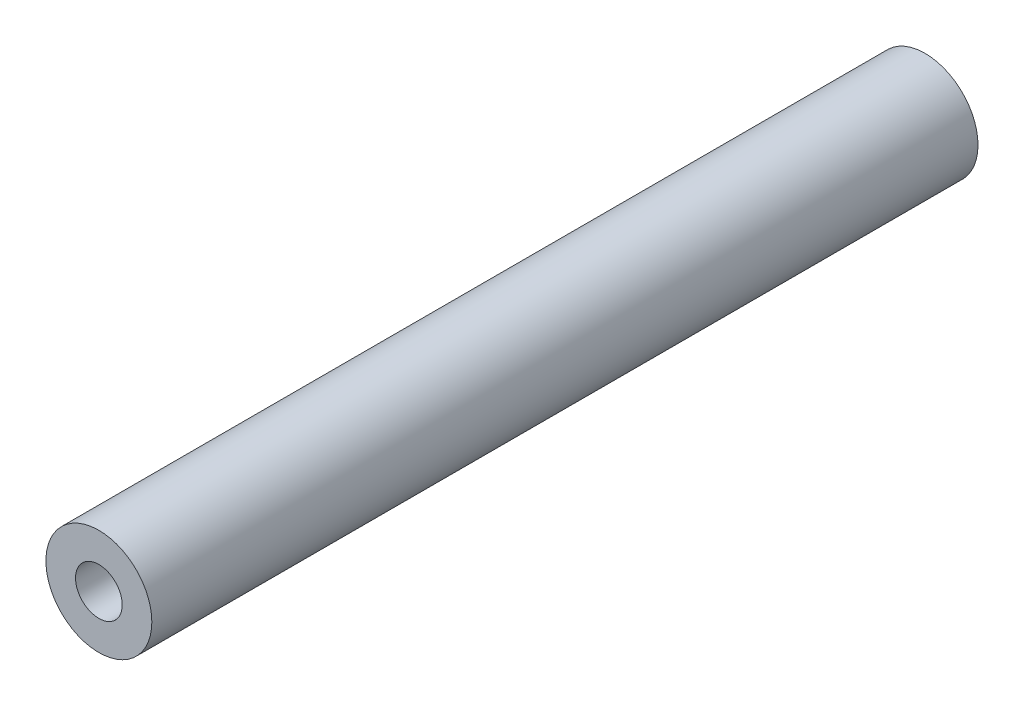
ISO-10303-21;
HEADER;
FILE_DESCRIPTION(('STEP AP214'),'2;1');
FILE_NAME('part.step','',(''),(''),'','','');
FILE_SCHEMA(('AUTOMOTIVE_DESIGN { 1 0 10303 214 1 1 1 1 }'));
ENDSEC;
DATA;
#1=APPLICATION_CONTEXT('core data for automotive mechanical design processes');
#2=APPLICATION_PROTOCOL_DEFINITION('international standard','automotive_design',2000,#1);
#3=PRODUCT_CONTEXT('',#1,'mechanical');
#4=PRODUCT('Part','Part','',(#3));
#5=PRODUCT_RELATED_PRODUCT_CATEGORY('part','',(#4));
#6=PRODUCT_DEFINITION_FORMATION('','',#4);
#7=PRODUCT_DEFINITION_CONTEXT('part definition',#1,'design');
#8=PRODUCT_DEFINITION('design','',#6,#7);
#9=PRODUCT_DEFINITION_SHAPE('','',#8);
#10=(LENGTH_UNIT() NAMED_UNIT(*) SI_UNIT(.MILLI.,.METRE.));
#11=(NAMED_UNIT(*) PLANE_ANGLE_UNIT() SI_UNIT($,.RADIAN.));
#12=(NAMED_UNIT(*) SI_UNIT($,.STERADIAN.) SOLID_ANGLE_UNIT());
#13=UNCERTAINTY_MEASURE_WITH_UNIT(LENGTH_MEASURE(1.E-05),#10,'distance_accuracy_value','');
#14=(GEOMETRIC_REPRESENTATION_CONTEXT(3) GLOBAL_UNCERTAINTY_ASSIGNED_CONTEXT((#13)) GLOBAL_UNIT_ASSIGNED_CONTEXT((#10,
#11,#12)) REPRESENTATION_CONTEXT('',''));
#15=CARTESIAN_POINT('',(0.,0.,0.));
#16=DIRECTION('',(0.,0.,1.));
#17=DIRECTION('',(1.,0.,0.));
#18=AXIS2_PLACEMENT_3D('',#15,#16,#17);
#19=CARTESIAN_POINT('',(0.,0.,37.1475));
#20=DIRECTION('',(0.,0.,-1.));
#21=DIRECTION('',(-1.,0.,0.));
#22=AXIS2_PLACEMENT_3D('',#19,#20,#21);
#23=CYLINDRICAL_SURFACE('',#22,4.7625);
#24=CARTESIAN_POINT('',(0.,0.,37.1475));
#25=DIRECTION('',(0.,0.,1.));
#26=DIRECTION('',(1.,0.,0.));
#27=AXIS2_PLACEMENT_3D('',#24,#25,#26);
#28=CIRCLE('',#27,4.7625);
#29=CARTESIAN_POINT('',(4.7625,0.,37.1475));
#30=VERTEX_POINT('',#29);
#31=EDGE_CURVE('E11',#30,#30,#28,.T.);
#32=ORIENTED_EDGE('',*,*,#31,.F.);
#33=EDGE_LOOP('',(#32));
#34=FACE_BOUND('',#33,.T.);
#35=CARTESIAN_POINT('',(0.,0.,-37.1475));
#36=DIRECTION('',(0.,0.,1.));
#37=DIRECTION('',(1.,0.,0.));
#38=AXIS2_PLACEMENT_3D('',#35,#36,#37);
#39=CIRCLE('',#38,4.7625);
#40=CARTESIAN_POINT('',(4.7625,0.,-37.1475));
#41=VERTEX_POINT('',#40);
#42=EDGE_CURVE('E48',#41,#41,#39,.T.);
#43=ORIENTED_EDGE('',*,*,#42,.T.);
#44=EDGE_LOOP('',(#43));
#45=FACE_BOUND('',#44,.T.);
#46=ADVANCED_FACE('F40',(#34,#45),#23,.T.);
#47=CARTESIAN_POINT('',(0.,0.,37.1475));
#48=DIRECTION('',(0.,0.,1.));
#49=DIRECTION('',(1.,0.,0.));
#50=AXIS2_PLACEMENT_3D('',#47,#48,#49);
#51=PLANE('',#50);
#52=CARTESIAN_POINT('',(0.,0.,37.1475));
#53=DIRECTION('',(0.,0.,1.));
#54=DIRECTION('',(1.,0.,0.));
#55=AXIS2_PLACEMENT_3D('',#52,#53,#54);
#56=CIRCLE('',#55,2.09999999999999);
#57=CARTESIAN_POINT('',(2.09999999999999,0.,37.1475));
#58=VERTEX_POINT('',#57);
#59=EDGE_CURVE('E65',#58,#58,#56,.T.);
#60=ORIENTED_EDGE('',*,*,#59,.F.);
#61=EDGE_LOOP('',(#60));
#62=FACE_BOUND('',#61,.T.);
#63=ORIENTED_EDGE('',*,*,#31,.T.);
#64=EDGE_LOOP('',(#63));
#65=FACE_BOUND('',#64,.T.);
#66=ADVANCED_FACE('F86',(#62,#65),#51,.T.);
#67=CARTESIAN_POINT('',(0.,0.,-37.1475));
#68=DIRECTION('',(0.,0.,1.));
#69=DIRECTION('',(1.,0.,0.));
#70=AXIS2_PLACEMENT_3D('',#67,#68,#69);
#71=PLANE('',#70);
#72=CARTESIAN_POINT('',(0.,0.,-37.1475));
#73=DIRECTION('',(0.,0.,-1.));
#74=DIRECTION('',(-1.,0.,0.));
#75=AXIS2_PLACEMENT_3D('',#72,#73,#74);
#76=CIRCLE('',#75,2.09999999999999);
#77=CARTESIAN_POINT('',(-2.09999999999999,0.,-37.1475));
#78=VERTEX_POINT('',#77);
#79=EDGE_CURVE('E66',#78,#78,#76,.T.);
#80=ORIENTED_EDGE('',*,*,#79,.F.);
#81=EDGE_LOOP('',(#80));
#82=FACE_BOUND('',#81,.T.);
#83=ORIENTED_EDGE('',*,*,#42,.F.);
#84=EDGE_LOOP('',(#83));
#85=FACE_BOUND('',#84,.T.);
#86=ADVANCED_FACE('F83',(#82,#85),#71,.F.);
#87=CARTESIAN_POINT('',(0.,0.,24.4475));
#88=DIRECTION('',(0.,0.,1.));
#89=DIRECTION('',(1.,0.,0.));
#90=AXIS2_PLACEMENT_3D('',#87,#88,#89);
#91=CONICAL_SURFACE('',#90,2.1,1.02974425867665);
#92=CARTESIAN_POINT('',(0.,0.,23.1856927000421));
#93=VERTEX_POINT('',#92);
#94=VERTEX_LOOP('',#93);
#95=FACE_BOUND('',#94,.T.);
#96=CARTESIAN_POINT('',(0.,0.,24.4475));
#97=DIRECTION('',(0.,0.,1.));
#98=DIRECTION('',(1.,0.,0.));
#99=AXIS2_PLACEMENT_3D('',#96,#97,#98);
#100=CIRCLE('',#99,2.1);
#101=CARTESIAN_POINT('',(2.1,0.,24.4475));
#102=VERTEX_POINT('',#101);
#103=EDGE_CURVE('E71',#102,#102,#100,.T.);
#104=ORIENTED_EDGE('',*,*,#103,.T.);
#105=EDGE_LOOP('',(#104));
#106=FACE_BOUND('',#105,.T.);
#107=ADVANCED_FACE('F85',(#95,#106),#91,.F.);
#108=CARTESIAN_POINT('',(0.,0.,37.1475));
#109=DIRECTION('',(0.,0.,1.));
#110=DIRECTION('',(1.,0.,0.));
#111=AXIS2_PLACEMENT_3D('',#108,#109,#110);
#112=CYLINDRICAL_SURFACE('',#111,2.09999999999999);
#113=ORIENTED_EDGE('',*,*,#103,.F.);
#114=EDGE_LOOP('',(#113));
#115=FACE_BOUND('',#114,.T.);
#116=ORIENTED_EDGE('',*,*,#59,.T.);
#117=EDGE_LOOP('',(#116));
#118=FACE_BOUND('',#117,.T.);
#119=ADVANCED_FACE('F58',(#115,#118),#112,.F.);
#120=CARTESIAN_POINT('',(0.,0.,-24.4475));
#121=DIRECTION('',(0.,0.,-1.));
#122=DIRECTION('',(-1.,0.,0.));
#123=AXIS2_PLACEMENT_3D('',#120,#121,#122);
#124=CONICAL_SURFACE('',#123,2.1,1.02974425867665);
#125=CARTESIAN_POINT('',(0.,0.,-23.1856927000421));
#126=VERTEX_POINT('',#125);
#127=VERTEX_LOOP('',#126);
#128=FACE_BOUND('',#127,.T.);
#129=CARTESIAN_POINT('',(0.,0.,-24.4475));
#130=DIRECTION('',(0.,0.,-1.));
#131=DIRECTION('',(-1.,0.,0.));
#132=AXIS2_PLACEMENT_3D('',#129,#130,#131);
#133=CIRCLE('',#132,2.1);
#134=CARTESIAN_POINT('',(-2.1,0.,-24.4475));
#135=VERTEX_POINT('',#134);
#136=EDGE_CURVE('E62',#135,#135,#133,.T.);
#137=ORIENTED_EDGE('',*,*,#136,.T.);
#138=EDGE_LOOP('',(#137));
#139=FACE_BOUND('',#138,.T.);
#140=ADVANCED_FACE('F54',(#128,#139),#124,.F.);
#141=CARTESIAN_POINT('',(0.,0.,-37.1475));
#142=DIRECTION('',(0.,0.,-1.));
#143=DIRECTION('',(-1.,0.,0.));
#144=AXIS2_PLACEMENT_3D('',#141,#142,#143);
#145=CYLINDRICAL_SURFACE('',#144,2.09999999999999);
#146=ORIENTED_EDGE('',*,*,#136,.F.);
#147=EDGE_LOOP('',(#146));
#148=FACE_BOUND('',#147,.T.);
#149=ORIENTED_EDGE('',*,*,#79,.T.);
#150=EDGE_LOOP('',(#149));
#151=FACE_BOUND('',#150,.T.);
#152=ADVANCED_FACE('F57',(#148,#151),#145,.F.);
#153=CLOSED_SHELL('',(#46,#66,#86,#107,#119,#140,#152));
#154=MANIFOLD_SOLID_BREP('B2',#153);
#155=ADVANCED_BREP_SHAPE_REPRESENTATION('',(#18,#154),#14);
#156=SHAPE_DEFINITION_REPRESENTATION(#9,#155);
ENDSEC;
END-ISO-10303-21;
